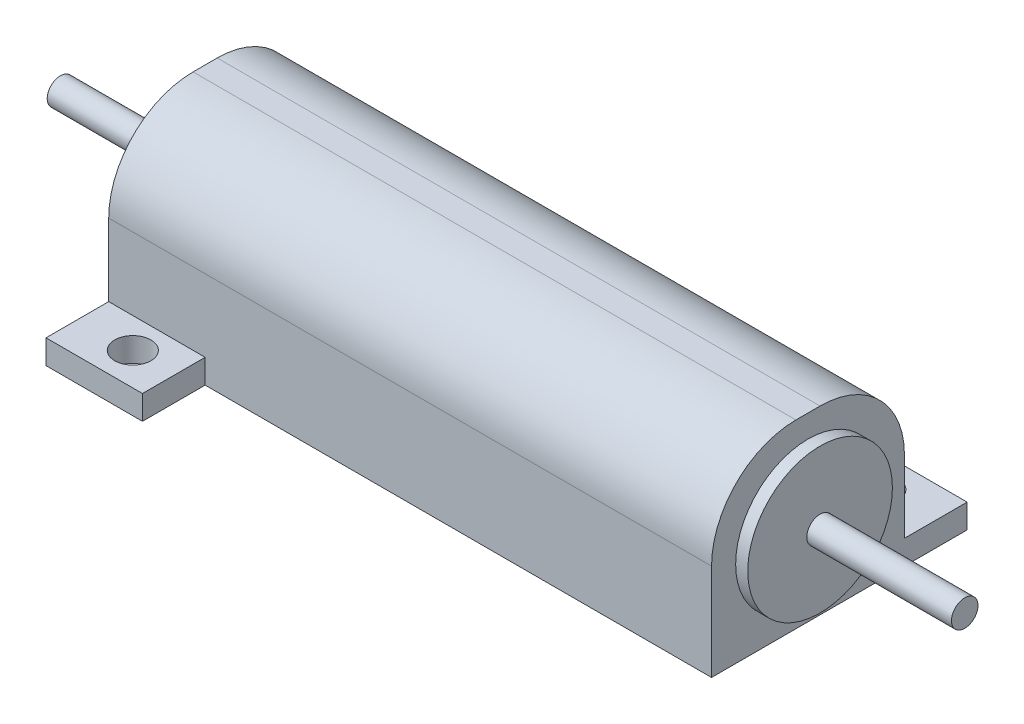
ISO-10303-21;
HEADER;
FILE_DESCRIPTION(('STEP AP214'),'2;1');
FILE_NAME('part.step','',(''),(''),'','','');
FILE_SCHEMA(('AUTOMOTIVE_DESIGN { 1 0 10303 214 1 1 1 1 }'));
ENDSEC;
DATA;
#1=APPLICATION_CONTEXT('core data for automotive mechanical design processes');
#2=APPLICATION_PROTOCOL_DEFINITION('international standard','automotive_design',2000,#1);
#3=PRODUCT_CONTEXT('',#1,'mechanical');
#4=PRODUCT('Part','Part','',(#3));
#5=PRODUCT_RELATED_PRODUCT_CATEGORY('part','',(#4));
#6=PRODUCT_DEFINITION_FORMATION('','',#4);
#7=PRODUCT_DEFINITION_CONTEXT('part definition',#1,'design');
#8=PRODUCT_DEFINITION('design','',#6,#7);
#9=PRODUCT_DEFINITION_SHAPE('','',#8);
#10=(LENGTH_UNIT() NAMED_UNIT(*) SI_UNIT(.MILLI.,.METRE.));
#11=(NAMED_UNIT(*) PLANE_ANGLE_UNIT() SI_UNIT($,.RADIAN.));
#12=(NAMED_UNIT(*) SI_UNIT($,.STERADIAN.) SOLID_ANGLE_UNIT());
#13=UNCERTAINTY_MEASURE_WITH_UNIT(LENGTH_MEASURE(1.E-05),#10,'distance_accuracy_value','');
#14=(GEOMETRIC_REPRESENTATION_CONTEXT(3) GLOBAL_UNCERTAINTY_ASSIGNED_CONTEXT((#13)) GLOBAL_UNIT_ASSIGNED_CONTEXT((#10,
#11,#12)) REPRESENTATION_CONTEXT('',''));
#15=CARTESIAN_POINT('',(0.,0.,0.));
#16=DIRECTION('',(0.,0.,1.));
#17=DIRECTION('',(1.,0.,0.));
#18=AXIS2_PLACEMENT_3D('',#15,#16,#17);
#19=CARTESIAN_POINT('',(0.,15.,0.));
#20=DIRECTION('',(1.,0.,0.));
#21=DIRECTION('',(0.,0.,-1.));
#22=AXIS2_PLACEMENT_3D('',#19,#20,#21);
#23=PLANE('',#22);
#24=CARTESIAN_POINT('',(0.,7.12816694311815,8.));
#25=DIRECTION('',(1.,0.,0.));
#26=DIRECTION('',(0.,0.,-1.));
#27=AXIS2_PLACEMENT_3D('',#24,#25,#26);
#28=CIRCLE('',#27,6.);
#29=CARTESIAN_POINT('',(0.,7.12816694311815,2.));
#30=VERTEX_POINT('',#29);
#31=EDGE_CURVE('E155',#30,#30,#28,.T.);
#32=ORIENTED_EDGE('',*,*,#31,.T.);
#33=EDGE_LOOP('',(#32));
#34=FACE_BOUND('',#33,.T.);
#35=DIRECTION('',(0.,-1.,0.));
#36=VECTOR('',#35,1.);
#37=CARTESIAN_POINT('',(0.,15.,16.));
#38=LINE('',#37,#36);
#39=CARTESIAN_POINT('',(0.,8.,16.));
#40=VERTEX_POINT('',#39);
#41=CARTESIAN_POINT('',(0.,2.,16.));
#42=VERTEX_POINT('',#41);
#43=EDGE_CURVE('E231',#40,#42,#38,.T.);
#44=ORIENTED_EDGE('',*,*,#43,.F.);
#45=CARTESIAN_POINT('',(0.,8.,9.));
#46=DIRECTION('',(1.,0.,0.));
#47=DIRECTION('',(0.,0.,-1.));
#48=AXIS2_PLACEMENT_3D('',#45,#46,#47);
#49=CIRCLE('',#48,7.);
#50=CARTESIAN_POINT('',(0.,15.,9.));
#51=VERTEX_POINT('',#50);
#52=EDGE_CURVE('E245',#40,#51,#49,.F.);
#53=ORIENTED_EDGE('',*,*,#52,.T.);
#54=DIRECTION('',(0.,0.,1.));
#55=VECTOR('',#54,1.);
#56=CARTESIAN_POINT('',(0.,15.,0.));
#57=LINE('',#56,#55);
#58=CARTESIAN_POINT('',(0.,15.,7.));
#59=VERTEX_POINT('',#58);
#60=EDGE_CURVE('E216',#59,#51,#57,.T.);
#61=ORIENTED_EDGE('',*,*,#60,.F.);
#62=CARTESIAN_POINT('',(0.,8.,7.));
#63=DIRECTION('',(1.,0.,0.));
#64=DIRECTION('',(0.,0.,-1.));
#65=AXIS2_PLACEMENT_3D('',#62,#63,#64);
#66=CIRCLE('',#65,7.);
#67=CARTESIAN_POINT('',(0.,8.,0.));
#68=VERTEX_POINT('',#67);
#69=EDGE_CURVE('E58',#59,#68,#66,.F.);
#70=ORIENTED_EDGE('',*,*,#69,.T.);
#71=DIRECTION('',(0.,-1.,0.));
#72=VECTOR('',#71,1.);
#73=CARTESIAN_POINT('',(0.,15.,0.));
#74=LINE('',#73,#72);
#75=CARTESIAN_POINT('',(0.,0.,0.));
#76=VERTEX_POINT('',#75);
#77=EDGE_CURVE('E222',#68,#76,#74,.T.);
#78=ORIENTED_EDGE('',*,*,#77,.T.);
#79=DIRECTION('',(0.,0.,1.));
#80=VECTOR('',#79,1.);
#81=CARTESIAN_POINT('',(0.,0.,0.));
#82=LINE('',#81,#80);
#83=CARTESIAN_POINT('',(0.,0.,21.2));
#84=VERTEX_POINT('',#83);
#85=EDGE_CURVE('E211',#76,#84,#82,.T.);
#86=ORIENTED_EDGE('',*,*,#85,.T.);
#87=DIRECTION('',(0.,-1.,0.));
#88=VECTOR('',#87,1.);
#89=CARTESIAN_POINT('',(0.,2.,21.2));
#90=LINE('',#89,#88);
#91=CARTESIAN_POINT('',(0.,2.,21.2));
#92=VERTEX_POINT('',#91);
#93=EDGE_CURVE('E208',#92,#84,#90,.T.);
#94=ORIENTED_EDGE('',*,*,#93,.F.);
#95=DIRECTION('',(0.,0.,-1.));
#96=VECTOR('',#95,1.);
#97=CARTESIAN_POINT('',(0.,2.,16.));
#98=LINE('',#97,#96);
#99=EDGE_CURVE('E190',#92,#42,#98,.T.);
#100=ORIENTED_EDGE('',*,*,#99,.T.);
#101=EDGE_LOOP('',(#44,#53,#61,#70,#78,#86,#94,#100));
#102=FACE_BOUND('',#101,.T.);
#103=ADVANCED_FACE('F41',(#34,#102),#23,.F.);
#104=CARTESIAN_POINT('',(0.,15.,16.));
#105=DIRECTION('',(0.,0.,-1.));
#106=DIRECTION('',(-1.,0.,0.));
#107=AXIS2_PLACEMENT_3D('',#104,#105,#106);
#108=PLANE('',#107);
#109=DIRECTION('',(0.,-1.,0.));
#110=VECTOR('',#109,1.);
#111=CARTESIAN_POINT('',(50.,15.,16.));
#112=LINE('',#111,#110);
#113=CARTESIAN_POINT('',(50.,8.,16.));
#114=VERTEX_POINT('',#113);
#115=CARTESIAN_POINT('',(50.,0.,16.));
#116=VERTEX_POINT('',#115);
#117=EDGE_CURVE('E139',#114,#116,#112,.T.);
#118=ORIENTED_EDGE('',*,*,#117,.F.);
#119=DIRECTION('',(1.,0.,0.));
#120=VECTOR('',#119,1.);
#121=CARTESIAN_POINT('',(0.,8.,16.));
#122=LINE('',#121,#120);
#123=EDGE_CURVE('E66',#114,#40,#122,.F.);
#124=ORIENTED_EDGE('',*,*,#123,.T.);
#125=ORIENTED_EDGE('',*,*,#43,.T.);
#126=DIRECTION('',(1.,0.,0.));
#127=VECTOR('',#126,1.);
#128=CARTESIAN_POINT('',(0.,2.,16.));
#129=LINE('',#128,#127);
#130=CARTESIAN_POINT('',(8.,2.,16.));
#131=VERTEX_POINT('',#130);
#132=EDGE_CURVE('E193',#42,#131,#129,.T.);
#133=ORIENTED_EDGE('',*,*,#132,.T.);
#134=DIRECTION('',(0.,-1.,0.));
#135=VECTOR('',#134,1.);
#136=CARTESIAN_POINT('',(8.,2.,16.));
#137=LINE('',#136,#135);
#138=CARTESIAN_POINT('',(8.,0.,16.));
#139=VERTEX_POINT('',#138);
#140=EDGE_CURVE('E203',#131,#139,#137,.T.);
#141=ORIENTED_EDGE('',*,*,#140,.T.);
#142=DIRECTION('',(1.,0.,0.));
#143=VECTOR('',#142,1.);
#144=CARTESIAN_POINT('',(0.,0.,16.));
#145=LINE('',#144,#143);
#146=EDGE_CURVE('E145',#139,#116,#145,.T.);
#147=ORIENTED_EDGE('',*,*,#146,.T.);
#148=EDGE_LOOP('',(#118,#124,#125,#133,#141,#147));
#149=FACE_BOUND('',#148,.T.);
#150=ADVANCED_FACE('F281',(#149),#108,.F.);
#151=CARTESIAN_POINT('',(50.,15.,0.));
#152=DIRECTION('',(-1.,0.,0.));
#153=DIRECTION('',(0.,0.,1.));
#154=AXIS2_PLACEMENT_3D('',#151,#152,#153);
#155=PLANE('',#154);
#156=CARTESIAN_POINT('',(50.,7.12816694311815,8.));
#157=DIRECTION('',(-1.,0.,0.));
#158=DIRECTION('',(0.,0.,1.));
#159=AXIS2_PLACEMENT_3D('',#156,#157,#158);
#160=CIRCLE('',#159,6.);
#161=CARTESIAN_POINT('',(50.,7.12816694311815,14.));
#162=VERTEX_POINT('',#161);
#163=EDGE_CURVE('E247',#162,#162,#160,.T.);
#164=ORIENTED_EDGE('',*,*,#163,.T.);
#165=EDGE_LOOP('',(#164));
#166=FACE_BOUND('',#165,.T.);
#167=DIRECTION('',(0.,0.,-1.));
#168=VECTOR('',#167,1.);
#169=CARTESIAN_POINT('',(50.,15.,0.));
#170=LINE('',#169,#168);
#171=CARTESIAN_POINT('',(50.,15.,9.));
#172=VERTEX_POINT('',#171);
#173=CARTESIAN_POINT('',(50.,15.,7.));
#174=VERTEX_POINT('',#173);
#175=EDGE_CURVE('E219',#172,#174,#170,.T.);
#176=ORIENTED_EDGE('',*,*,#175,.F.);
#177=CARTESIAN_POINT('',(50.,8.,9.));
#178=DIRECTION('',(-1.,0.,0.));
#179=DIRECTION('',(0.,0.,1.));
#180=AXIS2_PLACEMENT_3D('',#177,#178,#179);
#181=CIRCLE('',#180,7.);
#182=EDGE_CURVE('E241',#172,#114,#181,.F.);
#183=ORIENTED_EDGE('',*,*,#182,.T.);
#184=ORIENTED_EDGE('',*,*,#117,.T.);
#185=DIRECTION('',(0.,0.,-1.));
#186=VECTOR('',#185,1.);
#187=CARTESIAN_POINT('',(50.,0.,0.));
#188=LINE('',#187,#186);
#189=CARTESIAN_POINT('',(50.,0.,-5.2));
#190=VERTEX_POINT('',#189);
#191=EDGE_CURVE('E132',#116,#190,#188,.T.);
#192=ORIENTED_EDGE('',*,*,#191,.T.);
#193=DIRECTION('',(0.,-1.,0.));
#194=VECTOR('',#193,1.);
#195=CARTESIAN_POINT('',(50.,2.,-5.2));
#196=LINE('',#195,#194);
#197=CARTESIAN_POINT('',(50.,2.,-5.2));
#198=VERTEX_POINT('',#197);
#199=EDGE_CURVE('E137',#198,#190,#196,.T.);
#200=ORIENTED_EDGE('',*,*,#199,.F.);
#201=DIRECTION('',(0.,0.,1.));
#202=VECTOR('',#201,1.);
#203=CARTESIAN_POINT('',(50.,2.,0.));
#204=LINE('',#203,#202);
#205=CARTESIAN_POINT('',(50.,2.,0.));
#206=VERTEX_POINT('',#205);
#207=EDGE_CURVE('E163',#198,#206,#204,.T.);
#208=ORIENTED_EDGE('',*,*,#207,.T.);
#209=DIRECTION('',(0.,-1.,0.));
#210=VECTOR('',#209,1.);
#211=CARTESIAN_POINT('',(50.,15.,0.));
#212=LINE('',#211,#210);
#213=CARTESIAN_POINT('',(50.,8.,0.));
#214=VERTEX_POINT('',#213);
#215=EDGE_CURVE('E228',#214,#206,#212,.T.);
#216=ORIENTED_EDGE('',*,*,#215,.F.);
#217=CARTESIAN_POINT('',(50.,8.,7.));
#218=DIRECTION('',(-1.,0.,0.));
#219=DIRECTION('',(0.,0.,1.));
#220=AXIS2_PLACEMENT_3D('',#217,#218,#219);
#221=CIRCLE('',#220,7.);
#222=EDGE_CURVE('E239',#214,#174,#221,.F.);
#223=ORIENTED_EDGE('',*,*,#222,.T.);
#224=EDGE_LOOP('',(#176,#183,#184,#192,#200,#208,#216,#223));
#225=FACE_BOUND('',#224,.T.);
#226=ADVANCED_FACE('F135',(#166,#225),#155,.F.);
#227=CARTESIAN_POINT('',(0.,15.,0.));
#228=DIRECTION('',(0.,0.,1.));
#229=DIRECTION('',(1.,0.,0.));
#230=AXIS2_PLACEMENT_3D('',#227,#228,#229);
#231=PLANE('',#230);
#232=ORIENTED_EDGE('',*,*,#77,.F.);
#233=DIRECTION('',(-1.,0.,0.));
#234=VECTOR('',#233,1.);
#235=CARTESIAN_POINT('',(50.,8.,0.));
#236=LINE('',#235,#234);
#237=EDGE_CURVE('E50',#68,#214,#236,.F.);
#238=ORIENTED_EDGE('',*,*,#237,.T.);
#239=ORIENTED_EDGE('',*,*,#215,.T.);
#240=DIRECTION('',(-1.,0.,0.));
#241=VECTOR('',#240,1.);
#242=CARTESIAN_POINT('',(50.,2.,0.));
#243=LINE('',#242,#241);
#244=CARTESIAN_POINT('',(42.,2.,0.));
#245=VERTEX_POINT('',#244);
#246=EDGE_CURVE('E167',#206,#245,#243,.T.);
#247=ORIENTED_EDGE('',*,*,#246,.T.);
#248=DIRECTION('',(0.,-1.,0.));
#249=VECTOR('',#248,1.);
#250=CARTESIAN_POINT('',(42.,2.,0.));
#251=LINE('',#250,#249);
#252=CARTESIAN_POINT('',(42.,0.,0.));
#253=VERTEX_POINT('',#252);
#254=EDGE_CURVE('E173',#245,#253,#251,.T.);
#255=ORIENTED_EDGE('',*,*,#254,.T.);
#256=DIRECTION('',(-1.,0.,0.));
#257=VECTOR('',#256,1.);
#258=CARTESIAN_POINT('',(0.,0.,0.));
#259=LINE('',#258,#257);
#260=EDGE_CURVE('E144',#253,#76,#259,.T.);
#261=ORIENTED_EDGE('',*,*,#260,.T.);
#262=EDGE_LOOP('',(#232,#238,#239,#247,#255,#261));
#263=FACE_BOUND('',#262,.T.);
#264=ADVANCED_FACE('F345',(#263),#231,.F.);
#265=CARTESIAN_POINT('',(0.,15.,0.));
#266=DIRECTION('',(0.,1.,0.));
#267=DIRECTION('',(0.,0.,1.));
#268=AXIS2_PLACEMENT_3D('',#265,#266,#267);
#269=PLANE('',#268);
#270=ORIENTED_EDGE('',*,*,#60,.T.);
#271=DIRECTION('',(1.,0.,0.));
#272=VECTOR('',#271,1.);
#273=CARTESIAN_POINT('',(50.,15.,9.));
#274=LINE('',#273,#272);
#275=EDGE_CURVE('E236',#51,#172,#274,.T.);
#276=ORIENTED_EDGE('',*,*,#275,.T.);
#277=ORIENTED_EDGE('',*,*,#175,.T.);
#278=DIRECTION('',(-1.,0.,0.));
#279=VECTOR('',#278,1.);
#280=CARTESIAN_POINT('',(0.,15.,7.));
#281=LINE('',#280,#279);
#282=EDGE_CURVE('E233',#174,#59,#281,.T.);
#283=ORIENTED_EDGE('',*,*,#282,.T.);
#284=EDGE_LOOP('',(#270,#276,#277,#283));
#285=FACE_BOUND('',#284,.T.);
#286=ADVANCED_FACE('F276',(#285),#269,.T.);
#287=CARTESIAN_POINT('',(0.,0.,0.));
#288=DIRECTION('',(0.,1.,0.));
#289=DIRECTION('',(0.,0.,1.));
#290=AXIS2_PLACEMENT_3D('',#287,#288,#289);
#291=PLANE('',#290);
#292=ORIENTED_EDGE('',*,*,#85,.F.);
#293=ORIENTED_EDGE('',*,*,#260,.F.);
#294=DIRECTION('',(0.,0.,-1.));
#295=VECTOR('',#294,1.);
#296=CARTESIAN_POINT('',(42.,0.,0.));
#297=LINE('',#296,#295);
#298=CARTESIAN_POINT('',(42.,0.,-5.2));
#299=VERTEX_POINT('',#298);
#300=EDGE_CURVE('E162',#253,#299,#297,.T.);
#301=ORIENTED_EDGE('',*,*,#300,.T.);
#302=DIRECTION('',(1.,0.,0.));
#303=VECTOR('',#302,1.);
#304=CARTESIAN_POINT('',(50.,0.,-5.2));
#305=LINE('',#304,#303);
#306=EDGE_CURVE('E151',#299,#190,#305,.T.);
#307=ORIENTED_EDGE('',*,*,#306,.T.);
#308=ORIENTED_EDGE('',*,*,#191,.F.);
#309=ORIENTED_EDGE('',*,*,#146,.F.);
#310=DIRECTION('',(0.,0.,1.));
#311=VECTOR('',#310,1.);
#312=CARTESIAN_POINT('',(8.,0.,16.));
#313=LINE('',#312,#311);
#314=CARTESIAN_POINT('',(8.,0.,21.2));
#315=VERTEX_POINT('',#314);
#316=EDGE_CURVE('E187',#139,#315,#313,.T.);
#317=ORIENTED_EDGE('',*,*,#316,.T.);
#318=DIRECTION('',(-1.,0.,0.));
#319=VECTOR('',#318,1.);
#320=CARTESIAN_POINT('',(0.,0.,21.2));
#321=LINE('',#320,#319);
#322=EDGE_CURVE('E194',#315,#84,#321,.T.);
#323=ORIENTED_EDGE('',*,*,#322,.T.);
#324=EDGE_LOOP('',(#292,#293,#301,#307,#308,#309,#317,#323));
#325=FACE_BOUND('',#324,.T.);
#326=CARTESIAN_POINT('',(4.5,0.,18.5));
#327=DIRECTION('',(0.,-1.,0.));
#328=DIRECTION('',(0.,0.,-1.));
#329=AXIS2_PLACEMENT_3D('',#326,#327,#328);
#330=CIRCLE('',#329,1.5);
#331=CARTESIAN_POINT('',(4.5,0.,17.));
#332=VERTEX_POINT('',#331);
#333=EDGE_CURVE('E181',#332,#332,#330,.T.);
#334=ORIENTED_EDGE('',*,*,#333,.F.);
#335=EDGE_LOOP('',(#334));
#336=FACE_BOUND('',#335,.T.);
#337=CARTESIAN_POINT('',(45.5,0.,-2.5));
#338=DIRECTION('',(0.,-1.,0.));
#339=DIRECTION('',(0.,0.,-1.));
#340=AXIS2_PLACEMENT_3D('',#337,#338,#339);
#341=CIRCLE('',#340,1.5);
#342=CARTESIAN_POINT('',(45.5,0.,-4.));
#343=VERTEX_POINT('',#342);
#344=EDGE_CURVE('E178',#343,#343,#341,.T.);
#345=ORIENTED_EDGE('',*,*,#344,.F.);
#346=EDGE_LOOP('',(#345));
#347=FACE_BOUND('',#346,.T.);
#348=ADVANCED_FACE('F159',(#325,#336,#347),#291,.F.);
#349=CARTESIAN_POINT('',(0.,2.,21.2));
#350=DIRECTION('',(0.,0.,1.));
#351=DIRECTION('',(1.,0.,0.));
#352=AXIS2_PLACEMENT_3D('',#349,#350,#351);
#353=PLANE('',#352);
#354=ORIENTED_EDGE('',*,*,#322,.F.);
#355=DIRECTION('',(0.,-1.,0.));
#356=VECTOR('',#355,1.);
#357=CARTESIAN_POINT('',(8.,2.,21.2));
#358=LINE('',#357,#356);
#359=CARTESIAN_POINT('',(8.,2.,21.2));
#360=VERTEX_POINT('',#359);
#361=EDGE_CURVE('E212',#360,#315,#358,.T.);
#362=ORIENTED_EDGE('',*,*,#361,.F.);
#363=DIRECTION('',(-1.,0.,0.));
#364=VECTOR('',#363,1.);
#365=CARTESIAN_POINT('',(0.,2.,21.2));
#366=LINE('',#365,#364);
#367=EDGE_CURVE('E200',#360,#92,#366,.T.);
#368=ORIENTED_EDGE('',*,*,#367,.T.);
#369=ORIENTED_EDGE('',*,*,#93,.T.);
#370=EDGE_LOOP('',(#354,#362,#368,#369));
#371=FACE_BOUND('',#370,.T.);
#372=ADVANCED_FACE('F285',(#371),#353,.T.);
#373=CARTESIAN_POINT('',(8.,2.,16.));
#374=DIRECTION('',(1.,0.,0.));
#375=DIRECTION('',(0.,0.,-1.));
#376=AXIS2_PLACEMENT_3D('',#373,#374,#375);
#377=PLANE('',#376);
#378=ORIENTED_EDGE('',*,*,#316,.F.);
#379=ORIENTED_EDGE('',*,*,#140,.F.);
#380=DIRECTION('',(0.,0.,1.));
#381=VECTOR('',#380,1.);
#382=CARTESIAN_POINT('',(8.,2.,16.));
#383=LINE('',#382,#381);
#384=EDGE_CURVE('E197',#131,#360,#383,.T.);
#385=ORIENTED_EDGE('',*,*,#384,.T.);
#386=ORIENTED_EDGE('',*,*,#361,.T.);
#387=EDGE_LOOP('',(#378,#379,#385,#386));
#388=FACE_BOUND('',#387,.T.);
#389=ADVANCED_FACE('F292',(#388),#377,.T.);
#390=CARTESIAN_POINT('',(0.,2.,0.));
#391=DIRECTION('',(0.,1.,0.));
#392=DIRECTION('',(0.,0.,1.));
#393=AXIS2_PLACEMENT_3D('',#390,#391,#392);
#394=PLANE('',#393);
#395=CARTESIAN_POINT('',(4.5,2.,18.5));
#396=DIRECTION('',(0.,-1.,0.));
#397=DIRECTION('',(0.,0.,-1.));
#398=AXIS2_PLACEMENT_3D('',#395,#396,#397);
#399=CIRCLE('',#398,1.5);
#400=CARTESIAN_POINT('',(4.5,2.,17.));
#401=VERTEX_POINT('',#400);
#402=EDGE_CURVE('E184',#401,#401,#399,.T.);
#403=ORIENTED_EDGE('',*,*,#402,.T.);
#404=EDGE_LOOP('',(#403));
#405=FACE_BOUND('',#404,.T.);
#406=ORIENTED_EDGE('',*,*,#99,.F.);
#407=ORIENTED_EDGE('',*,*,#367,.F.);
#408=ORIENTED_EDGE('',*,*,#384,.F.);
#409=ORIENTED_EDGE('',*,*,#132,.F.);
#410=EDGE_LOOP('',(#406,#407,#408,#409));
#411=FACE_BOUND('',#410,.T.);
#412=ADVANCED_FACE('F290',(#405,#411),#394,.T.);
#413=CARTESIAN_POINT('',(4.5,2.,18.5));
#414=DIRECTION('',(0.,-1.,0.));
#415=DIRECTION('',(0.,0.,-1.));
#416=AXIS2_PLACEMENT_3D('',#413,#414,#415);
#417=CYLINDRICAL_SURFACE('',#416,1.5);
#418=ORIENTED_EDGE('',*,*,#402,.F.);
#419=EDGE_LOOP('',(#418));
#420=FACE_BOUND('',#419,.T.);
#421=ORIENTED_EDGE('',*,*,#333,.T.);
#422=EDGE_LOOP('',(#421));
#423=FACE_BOUND('',#422,.T.);
#424=ADVANCED_FACE('F299',(#420,#423),#417,.F.);
#425=CARTESIAN_POINT('',(50.,2.,-5.2));
#426=DIRECTION('',(0.,0.,-1.));
#427=DIRECTION('',(-1.,0.,0.));
#428=AXIS2_PLACEMENT_3D('',#425,#426,#427);
#429=PLANE('',#428);
#430=ORIENTED_EDGE('',*,*,#306,.F.);
#431=DIRECTION('',(0.,-1.,0.));
#432=VECTOR('',#431,1.);
#433=CARTESIAN_POINT('',(42.,2.,-5.2));
#434=LINE('',#433,#432);
#435=CARTESIAN_POINT('',(42.,2.,-5.2));
#436=VERTEX_POINT('',#435);
#437=EDGE_CURVE('E154',#436,#299,#434,.T.);
#438=ORIENTED_EDGE('',*,*,#437,.F.);
#439=DIRECTION('',(1.,0.,0.));
#440=VECTOR('',#439,1.);
#441=CARTESIAN_POINT('',(50.,2.,-5.2));
#442=LINE('',#441,#440);
#443=EDGE_CURVE('E153',#436,#198,#442,.T.);
#444=ORIENTED_EDGE('',*,*,#443,.T.);
#445=ORIENTED_EDGE('',*,*,#199,.T.);
#446=EDGE_LOOP('',(#430,#438,#444,#445));
#447=FACE_BOUND('',#446,.T.);
#448=ADVANCED_FACE('F150',(#447),#429,.T.);
#449=CARTESIAN_POINT('',(42.,2.,0.));
#450=DIRECTION('',(-1.,0.,0.));
#451=DIRECTION('',(0.,0.,1.));
#452=AXIS2_PLACEMENT_3D('',#449,#450,#451);
#453=PLANE('',#452);
#454=ORIENTED_EDGE('',*,*,#300,.F.);
#455=ORIENTED_EDGE('',*,*,#254,.F.);
#456=DIRECTION('',(0.,0.,-1.));
#457=VECTOR('',#456,1.);
#458=CARTESIAN_POINT('',(42.,2.,0.));
#459=LINE('',#458,#457);
#460=EDGE_CURVE('E172',#245,#436,#459,.T.);
#461=ORIENTED_EDGE('',*,*,#460,.T.);
#462=ORIENTED_EDGE('',*,*,#437,.T.);
#463=EDGE_LOOP('',(#454,#455,#461,#462));
#464=FACE_BOUND('',#463,.T.);
#465=ADVANCED_FACE('F264',(#464),#453,.T.);
#466=CARTESIAN_POINT('',(0.,2.,0.));
#467=DIRECTION('',(0.,1.,0.));
#468=DIRECTION('',(0.,0.,1.));
#469=AXIS2_PLACEMENT_3D('',#466,#467,#468);
#470=PLANE('',#469);
#471=CARTESIAN_POINT('',(45.5,2.,-2.5));
#472=DIRECTION('',(0.,-1.,0.));
#473=DIRECTION('',(0.,0.,-1.));
#474=AXIS2_PLACEMENT_3D('',#471,#472,#473);
#475=CIRCLE('',#474,1.5);
#476=CARTESIAN_POINT('',(45.5,2.,-4.));
#477=VERTEX_POINT('',#476);
#478=EDGE_CURVE('E165',#477,#477,#475,.T.);
#479=ORIENTED_EDGE('',*,*,#478,.T.);
#480=EDGE_LOOP('',(#479));
#481=FACE_BOUND('',#480,.T.);
#482=ORIENTED_EDGE('',*,*,#207,.F.);
#483=ORIENTED_EDGE('',*,*,#443,.F.);
#484=ORIENTED_EDGE('',*,*,#460,.F.);
#485=ORIENTED_EDGE('',*,*,#246,.F.);
#486=EDGE_LOOP('',(#482,#483,#484,#485));
#487=FACE_BOUND('',#486,.T.);
#488=ADVANCED_FACE('F268',(#481,#487),#470,.T.);
#489=CARTESIAN_POINT('',(45.5,2.,-2.5));
#490=DIRECTION('',(0.,-1.,0.));
#491=DIRECTION('',(0.,0.,-1.));
#492=AXIS2_PLACEMENT_3D('',#489,#490,#491);
#493=CYLINDRICAL_SURFACE('',#492,1.5);
#494=ORIENTED_EDGE('',*,*,#478,.F.);
#495=EDGE_LOOP('',(#494));
#496=FACE_BOUND('',#495,.T.);
#497=ORIENTED_EDGE('',*,*,#344,.T.);
#498=EDGE_LOOP('',(#497));
#499=FACE_BOUND('',#498,.T.);
#500=ADVANCED_FACE('F313',(#496,#499),#493,.F.);
#501=CARTESIAN_POINT('',(0.,8.,9.));
#502=DIRECTION('',(-1.,0.,0.));
#503=DIRECTION('',(0.,0.,1.));
#504=AXIS2_PLACEMENT_3D('',#501,#502,#503);
#505=CYLINDRICAL_SURFACE('',#504,7.);
#506=ORIENTED_EDGE('',*,*,#52,.F.);
#507=ORIENTED_EDGE('',*,*,#123,.F.);
#508=ORIENTED_EDGE('',*,*,#182,.F.);
#509=ORIENTED_EDGE('',*,*,#275,.F.);
#510=EDGE_LOOP('',(#506,#507,#508,#509));
#511=FACE_BOUND('',#510,.T.);
#512=ADVANCED_FACE('F280',(#511),#505,.T.);
#513=CARTESIAN_POINT('',(0.,8.,7.));
#514=DIRECTION('',(1.,0.,0.));
#515=DIRECTION('',(0.,0.,-1.));
#516=AXIS2_PLACEMENT_3D('',#513,#514,#515);
#517=CYLINDRICAL_SURFACE('',#516,7.);
#518=ORIENTED_EDGE('',*,*,#222,.F.);
#519=ORIENTED_EDGE('',*,*,#237,.F.);
#520=ORIENTED_EDGE('',*,*,#69,.F.);
#521=ORIENTED_EDGE('',*,*,#282,.F.);
#522=EDGE_LOOP('',(#518,#519,#520,#521));
#523=FACE_BOUND('',#522,.T.);
#524=ADVANCED_FACE('F43',(#523),#517,.T.);
#525=CARTESIAN_POINT('',(51.,7.12816694311815,8.));
#526=DIRECTION('',(1.,0.,0.));
#527=DIRECTION('',(0.,0.,-1.));
#528=AXIS2_PLACEMENT_3D('',#525,#526,#527);
#529=PLANE('',#528);
#530=CARTESIAN_POINT('',(51.,7.12816694311815,8.));
#531=DIRECTION('',(1.,0.,0.));
#532=DIRECTION('',(0.,0.,-1.));
#533=AXIS2_PLACEMENT_3D('',#530,#531,#532);
#534=CIRCLE('',#533,1.1);
#535=CARTESIAN_POINT('',(51.,7.12816694311815,6.9));
#536=VERTEX_POINT('',#535);
#537=EDGE_CURVE('E11',#536,#536,#534,.T.);
#538=ORIENTED_EDGE('',*,*,#537,.F.);
#539=EDGE_LOOP('',(#538));
#540=FACE_BOUND('',#539,.T.);
#541=CARTESIAN_POINT('',(51.,7.12816694311815,8.));
#542=DIRECTION('',(1.,0.,0.));
#543=DIRECTION('',(0.,0.,-1.));
#544=AXIS2_PLACEMENT_3D('',#541,#542,#543);
#545=CIRCLE('',#544,6.);
#546=CARTESIAN_POINT('',(51.,7.12816694311815,2.));
#547=VERTEX_POINT('',#546);
#548=EDGE_CURVE('E255',#547,#547,#545,.T.);
#549=ORIENTED_EDGE('',*,*,#548,.T.);
#550=EDGE_LOOP('',(#549));
#551=FACE_BOUND('',#550,.T.);
#552=ADVANCED_FACE('F318',(#540,#551),#529,.T.);
#553=CARTESIAN_POINT('',(-0.999999999999994,7.12816694311815,8.));
#554=DIRECTION('',(1.,0.,0.));
#555=DIRECTION('',(0.,0.,-1.));
#556=AXIS2_PLACEMENT_3D('',#553,#554,#555);
#557=CYLINDRICAL_SURFACE('',#556,6.);
#558=ORIENTED_EDGE('',*,*,#548,.F.);
#559=EDGE_LOOP('',(#558));
#560=FACE_BOUND('',#559,.T.);
#561=ORIENTED_EDGE('',*,*,#163,.F.);
#562=EDGE_LOOP('',(#561));
#563=FACE_BOUND('',#562,.T.);
#564=ADVANCED_FACE('F480',(#560,#563),#557,.T.);
#565=CARTESIAN_POINT('',(-0.999999999999994,7.12816694311815,8.));
#566=DIRECTION('',(1.,0.,0.));
#567=DIRECTION('',(0.,0.,-1.));
#568=AXIS2_PLACEMENT_3D('',#565,#566,#567);
#569=CIRCLE('',#568,6.);
#570=CARTESIAN_POINT('',(-0.999999999999994,7.12816694311815,2.));
#571=VERTEX_POINT('',#570);
#572=EDGE_CURVE('E249',#571,#571,#569,.T.);
#573=ORIENTED_EDGE('',*,*,#572,.T.);
#574=EDGE_LOOP('',(#573));
#575=FACE_BOUND('',#574,.T.);
#576=ORIENTED_EDGE('',*,*,#31,.F.);
#577=EDGE_LOOP('',(#576));
#578=FACE_BOUND('',#577,.T.);
#579=ADVANCED_FACE('F490',(#575,#578),#557,.T.);
#580=CARTESIAN_POINT('',(-0.999999999999994,7.12816694311815,8.));
#581=DIRECTION('',(1.,0.,0.));
#582=DIRECTION('',(0.,0.,-1.));
#583=AXIS2_PLACEMENT_3D('',#580,#581,#582);
#584=PLANE('',#583);
#585=CARTESIAN_POINT('',(-0.999999999999994,7.12816694311815,8.));
#586=DIRECTION('',(1.,0.,0.));
#587=DIRECTION('',(0.,0.,-1.));
#588=AXIS2_PLACEMENT_3D('',#585,#586,#587);
#589=CIRCLE('',#588,1.1);
#590=CARTESIAN_POINT('',(-0.999999999999994,7.12816694311815,6.9));
#591=VERTEX_POINT('',#590);
#592=EDGE_CURVE('E45',#591,#591,#589,.T.);
#593=ORIENTED_EDGE('',*,*,#592,.T.);
#594=EDGE_LOOP('',(#593));
#595=FACE_BOUND('',#594,.T.);
#596=ORIENTED_EDGE('',*,*,#572,.F.);
#597=EDGE_LOOP('',(#596));
#598=FACE_BOUND('',#597,.T.);
#599=ADVANCED_FACE('F499',(#595,#598),#584,.F.);
#600=CARTESIAN_POINT('',(-12.,7.12816694311815,8.));
#601=DIRECTION('',(1.,0.,0.));
#602=DIRECTION('',(0.,0.,-1.));
#603=AXIS2_PLACEMENT_3D('',#600,#601,#602);
#604=PLANE('',#603);
#605=CARTESIAN_POINT('',(-12.,7.12816694311815,8.));
#606=DIRECTION('',(1.,0.,0.));
#607=DIRECTION('',(0.,0.,-1.));
#608=AXIS2_PLACEMENT_3D('',#605,#606,#607);
#609=CIRCLE('',#608,1.1);
#610=CARTESIAN_POINT('',(-12.,7.12816694311815,6.9));
#611=VERTEX_POINT('',#610);
#612=EDGE_CURVE('E570',#611,#611,#609,.T.);
#613=ORIENTED_EDGE('',*,*,#612,.F.);
#614=EDGE_LOOP('',(#613));
#615=FACE_BOUND('',#614,.T.);
#616=ADVANCED_FACE('F507',(#615),#604,.F.);
#617=CARTESIAN_POINT('',(-12.,7.12816694311815,8.));
#618=DIRECTION('',(1.,0.,0.));
#619=DIRECTION('',(0.,0.,-1.));
#620=AXIS2_PLACEMENT_3D('',#617,#618,#619);
#621=CYLINDRICAL_SURFACE('',#620,1.1);
#622=ORIENTED_EDGE('',*,*,#612,.T.);
#623=EDGE_LOOP('',(#622));
#624=FACE_BOUND('',#623,.T.);
#625=ORIENTED_EDGE('',*,*,#592,.F.);
#626=EDGE_LOOP('',(#625));
#627=FACE_BOUND('',#626,.T.);
#628=ADVANCED_FACE('F517',(#624,#627),#621,.T.);
#629=ORIENTED_EDGE('',*,*,#537,.T.);
#630=EDGE_LOOP('',(#629));
#631=FACE_BOUND('',#630,.T.);
#632=CARTESIAN_POINT('',(63.,7.12816694311815,8.));
#633=DIRECTION('',(1.,0.,0.));
#634=DIRECTION('',(0.,0.,-1.));
#635=AXIS2_PLACEMENT_3D('',#632,#633,#634);
#636=CIRCLE('',#635,1.1);
#637=CARTESIAN_POINT('',(63.,7.12816694311815,6.9));
#638=VERTEX_POINT('',#637);
#639=EDGE_CURVE('E568',#638,#638,#636,.T.);
#640=ORIENTED_EDGE('',*,*,#639,.F.);
#641=EDGE_LOOP('',(#640));
#642=FACE_BOUND('',#641,.T.);
#643=ADVANCED_FACE('F527',(#631,#642),#621,.T.);
#644=CARTESIAN_POINT('',(63.,7.12816694311815,8.));
#645=DIRECTION('',(1.,0.,0.));
#646=DIRECTION('',(0.,0.,-1.));
#647=AXIS2_PLACEMENT_3D('',#644,#645,#646);
#648=PLANE('',#647);
#649=ORIENTED_EDGE('',*,*,#639,.T.);
#650=EDGE_LOOP('',(#649));
#651=FACE_BOUND('',#650,.T.);
#652=ADVANCED_FACE('F537',(#651),#648,.T.);
#653=CLOSED_SHELL('',(#103,#150,#226,#264,#286,#348,#372,#389,#412,#424,#448,#465,#488,#500,
#512,#524,#552,#564,#579,#599,#616,#628,#643,#652));
#654=MANIFOLD_SOLID_BREP('B2',#653);
#655=ADVANCED_BREP_SHAPE_REPRESENTATION('',(#18,#654),#14);
#656=SHAPE_DEFINITION_REPRESENTATION(#9,#655);
ENDSEC;
END-ISO-10303-21;
